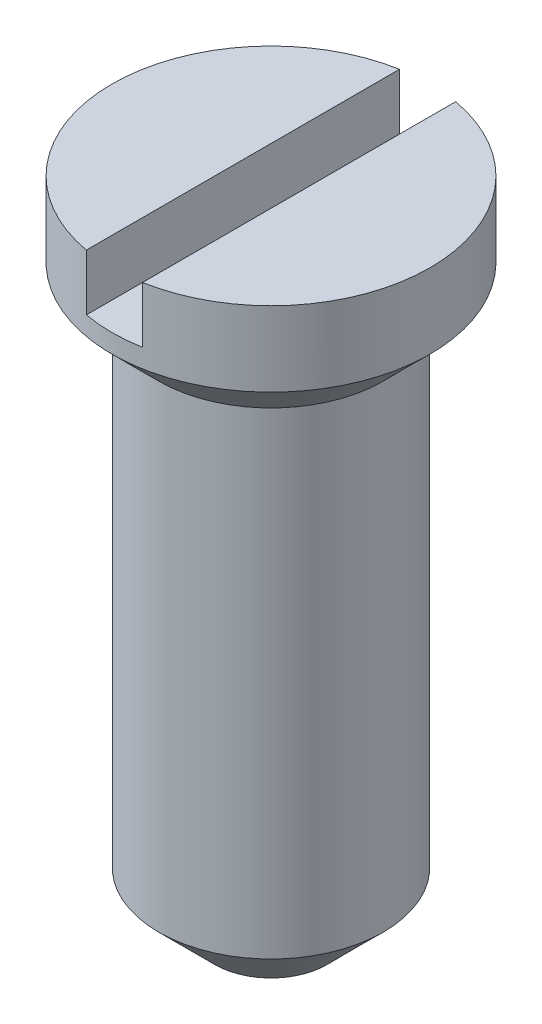
ISO-10303-21;
HEADER;
FILE_DESCRIPTION(('STEP AP214'),'2;1');
FILE_NAME('part.step','',(''),(''),'','','');
FILE_SCHEMA(('AUTOMOTIVE_DESIGN { 1 0 10303 214 1 1 1 1 }'));
ENDSEC;
DATA;
#1=APPLICATION_CONTEXT('core data for automotive mechanical design processes');
#2=APPLICATION_PROTOCOL_DEFINITION('international standard','automotive_design',2000,#1);
#3=PRODUCT_CONTEXT('',#1,'mechanical');
#4=PRODUCT('Part','Part','',(#3));
#5=PRODUCT_RELATED_PRODUCT_CATEGORY('part','',(#4));
#6=PRODUCT_DEFINITION_FORMATION('','',#4);
#7=PRODUCT_DEFINITION_CONTEXT('part definition',#1,'design');
#8=PRODUCT_DEFINITION('design','',#6,#7);
#9=PRODUCT_DEFINITION_SHAPE('','',#8);
#10=(LENGTH_UNIT() NAMED_UNIT(*) SI_UNIT(.MILLI.,.METRE.));
#11=(NAMED_UNIT(*) PLANE_ANGLE_UNIT() SI_UNIT($,.RADIAN.));
#12=(NAMED_UNIT(*) SI_UNIT($,.STERADIAN.) SOLID_ANGLE_UNIT());
#13=UNCERTAINTY_MEASURE_WITH_UNIT(LENGTH_MEASURE(1.E-05),#10,'distance_accuracy_value','');
#14=(GEOMETRIC_REPRESENTATION_CONTEXT(3) GLOBAL_UNCERTAINTY_ASSIGNED_CONTEXT((#13)) GLOBAL_UNIT_ASSIGNED_CONTEXT((#10,
#11,#12)) REPRESENTATION_CONTEXT('',''));
#15=CARTESIAN_POINT('',(0.,0.,0.));
#16=DIRECTION('',(0.,0.,1.));
#17=DIRECTION('',(1.,0.,0.));
#18=AXIS2_PLACEMENT_3D('',#15,#16,#17);
#19=CARTESIAN_POINT('',(0.,3.5,0.));
#20=DIRECTION('',(0.,1.,0.));
#21=DIRECTION('',(0.,0.,1.));
#22=AXIS2_PLACEMENT_3D('',#19,#20,#21);
#23=PLANE('',#22);
#24=DIRECTION('',(0.,0.,-1.));
#25=VECTOR('',#24,1.);
#26=CARTESIAN_POINT('',(0.15,3.5,0.));
#27=LINE('',#26,#25);
#28=CARTESIAN_POINT('',(0.15,3.5,0.836660026534075));
#29=VERTEX_POINT('',#28);
#30=CARTESIAN_POINT('',(0.15,3.5,-0.836660026534075));
#31=VERTEX_POINT('',#30);
#32=EDGE_CURVE('E81',#29,#31,#27,.T.);
#33=ORIENTED_EDGE('',*,*,#32,.F.);
#34=CARTESIAN_POINT('',(0.,3.5,0.));
#35=DIRECTION('',(0.,1.,0.));
#36=DIRECTION('',(0.,0.,1.));
#37=AXIS2_PLACEMENT_3D('',#34,#35,#36);
#38=CIRCLE('',#37,0.85);
#39=EDGE_CURVE('E93',#29,#31,#38,.T.);
#40=ORIENTED_EDGE('',*,*,#39,.T.);
#41=EDGE_LOOP('',(#33,#40));
#42=FACE_BOUND('',#41,.T.);
#43=ADVANCED_FACE('F33',(#42),#23,.T.);
#44=CARTESIAN_POINT('',(0.,3.5,0.));
#45=DIRECTION('',(0.,-1.,0.));
#46=DIRECTION('',(0.,0.,-1.));
#47=AXIS2_PLACEMENT_3D('',#44,#45,#46);
#48=CYLINDRICAL_SURFACE('',#47,0.85);
#49=ORIENTED_EDGE('',*,*,#39,.F.);
#50=DIRECTION('',(0.,-1.,0.));
#51=VECTOR('',#50,1.);
#52=CARTESIAN_POINT('',(0.15,3.5,0.836660026534075));
#53=LINE('',#52,#51);
#54=CARTESIAN_POINT('',(0.15,3.2,0.836660026534075));
#55=VERTEX_POINT('',#54);
#56=EDGE_CURVE('E116',#29,#55,#53,.T.);
#57=ORIENTED_EDGE('',*,*,#56,.T.);
#58=CARTESIAN_POINT('',(0.,3.2,0.));
#59=DIRECTION('',(0.,-1.,0.));
#60=DIRECTION('',(0.,0.,-1.));
#61=AXIS2_PLACEMENT_3D('',#58,#59,#60);
#62=CIRCLE('',#61,0.85);
#63=CARTESIAN_POINT('',(-0.15,3.2,0.836660026534075));
#64=VERTEX_POINT('',#63);
#65=EDGE_CURVE('E11',#55,#64,#62,.T.);
#66=ORIENTED_EDGE('',*,*,#65,.T.);
#67=DIRECTION('',(0.,-1.,0.));
#68=VECTOR('',#67,1.);
#69=CARTESIAN_POINT('',(-0.15,3.5,0.836660026534075));
#70=LINE('',#69,#68);
#71=CARTESIAN_POINT('',(-0.15,3.5,0.836660026534075));
#72=VERTEX_POINT('',#71);
#73=EDGE_CURVE('E76',#64,#72,#70,.F.);
#74=ORIENTED_EDGE('',*,*,#73,.T.);
#75=CARTESIAN_POINT('',(-0.15,3.5,-0.836660026534075));
#76=VERTEX_POINT('',#75);
#77=EDGE_CURVE('E88',#76,#72,#38,.T.);
#78=ORIENTED_EDGE('',*,*,#77,.F.);
#79=DIRECTION('',(0.,-1.,0.));
#80=VECTOR('',#79,1.);
#81=CARTESIAN_POINT('',(-0.15,3.5,-0.836660026534075));
#82=LINE('',#81,#80);
#83=CARTESIAN_POINT('',(-0.15,3.2,-0.836660026534075));
#84=VERTEX_POINT('',#83);
#85=EDGE_CURVE('E48',#76,#84,#82,.T.);
#86=ORIENTED_EDGE('',*,*,#85,.T.);
#87=CARTESIAN_POINT('',(0.15,3.2,-0.836660026534075));
#88=VERTEX_POINT('',#87);
#89=EDGE_CURVE('E37',#84,#88,#62,.T.);
#90=ORIENTED_EDGE('',*,*,#89,.T.);
#91=DIRECTION('',(0.,-1.,0.));
#92=VECTOR('',#91,1.);
#93=CARTESIAN_POINT('',(0.15,3.5,-0.836660026534075));
#94=LINE('',#93,#92);
#95=EDGE_CURVE('E56',#88,#31,#94,.F.);
#96=ORIENTED_EDGE('',*,*,#95,.T.);
#97=EDGE_LOOP('',(#49,#57,#66,#74,#78,#86,#90,#96));
#98=FACE_BOUND('',#97,.T.);
#99=CARTESIAN_POINT('',(0.,3.1,0.));
#100=DIRECTION('',(0.,-1.,0.));
#101=DIRECTION('',(0.,0.,-1.));
#102=AXIS2_PLACEMENT_3D('',#99,#100,#101);
#103=CIRCLE('',#102,0.85);
#104=CARTESIAN_POINT('',(0.,3.1,-0.85));
#105=VERTEX_POINT('',#104);
#106=EDGE_CURVE('E94',#105,#105,#103,.T.);
#107=ORIENTED_EDGE('',*,*,#106,.F.);
#108=EDGE_LOOP('',(#107));
#109=FACE_BOUND('',#108,.T.);
#110=ADVANCED_FACE('F86',(#98,#109),#48,.T.);
#111=DIRECTION('',(0.,0.,1.));
#112=VECTOR('',#111,1.);
#113=CARTESIAN_POINT('',(-0.15,3.5,0.));
#114=LINE('',#113,#112);
#115=EDGE_CURVE('E73',#76,#72,#114,.T.);
#116=ORIENTED_EDGE('',*,*,#115,.F.);
#117=ORIENTED_EDGE('',*,*,#77,.T.);
#118=EDGE_LOOP('',(#116,#117));
#119=FACE_BOUND('',#118,.T.);
#120=ADVANCED_FACE('F92',(#119),#23,.T.);
#121=CARTESIAN_POINT('',(0.,0.,0.));
#122=DIRECTION('',(0.,-1.,0.));
#123=DIRECTION('',(0.,0.,-1.));
#124=AXIS2_PLACEMENT_3D('',#121,#122,#123);
#125=CYLINDRICAL_SURFACE('',#124,0.6);
#126=CARTESIAN_POINT('',(0.,0.300000000000001,0.));
#127=DIRECTION('',(0.,1.,0.));
#128=DIRECTION('',(0.,0.,1.));
#129=AXIS2_PLACEMENT_3D('',#126,#127,#128);
#130=CIRCLE('',#129,0.6);
#131=CARTESIAN_POINT('',(0.,0.300000000000001,0.6));
#132=VERTEX_POINT('',#131);
#133=EDGE_CURVE('E82',#132,#132,#130,.T.);
#134=ORIENTED_EDGE('',*,*,#133,.T.);
#135=EDGE_LOOP('',(#134));
#136=FACE_BOUND('',#135,.T.);
#137=CARTESIAN_POINT('',(0.,2.85,0.));
#138=DIRECTION('',(0.,-1.,0.));
#139=DIRECTION('',(0.,0.,-1.));
#140=AXIS2_PLACEMENT_3D('',#137,#138,#139);
#141=CIRCLE('',#140,0.6);
#142=CARTESIAN_POINT('',(0.,2.85,-0.6));
#143=VERTEX_POINT('',#142);
#144=EDGE_CURVE('E99',#143,#143,#141,.T.);
#145=ORIENTED_EDGE('',*,*,#144,.T.);
#146=EDGE_LOOP('',(#145));
#147=FACE_BOUND('',#146,.T.);
#148=ADVANCED_FACE('F120',(#136,#147),#125,.T.);
#149=CARTESIAN_POINT('',(0.,3.1,0.));
#150=DIRECTION('',(0.,1.,0.));
#151=DIRECTION('',(0.,0.,1.));
#152=AXIS2_PLACEMENT_3D('',#149,#150,#151);
#153=CONICAL_SURFACE('',#152,0.85,0.785398163397448);
#154=ORIENTED_EDGE('',*,*,#144,.F.);
#155=EDGE_LOOP('',(#154));
#156=FACE_BOUND('',#155,.T.);
#157=ORIENTED_EDGE('',*,*,#106,.T.);
#158=EDGE_LOOP('',(#157));
#159=FACE_BOUND('',#158,.T.);
#160=ADVANCED_FACE('F122',(#156,#159),#153,.T.);
#161=CARTESIAN_POINT('',(0.,0.,0.));
#162=DIRECTION('',(0.,1.,0.));
#163=DIRECTION('',(0.,0.,1.));
#164=AXIS2_PLACEMENT_3D('',#161,#162,#163);
#165=PLANE('',#164);
#166=CARTESIAN_POINT('',(0.,0.,0.));
#167=DIRECTION('',(0.,1.,0.));
#168=DIRECTION('',(0.,0.,1.));
#169=AXIS2_PLACEMENT_3D('',#166,#167,#168);
#170=CIRCLE('',#169,0.3);
#171=CARTESIAN_POINT('',(0.,0.,0.3));
#172=VERTEX_POINT('',#171);
#173=EDGE_CURVE('E97',#172,#172,#170,.F.);
#174=ORIENTED_EDGE('',*,*,#173,.T.);
#175=EDGE_LOOP('',(#174));
#176=FACE_BOUND('',#175,.T.);
#177=ADVANCED_FACE('F125',(#176),#165,.F.);
#178=CARTESIAN_POINT('',(0.,0.,0.));
#179=DIRECTION('',(0.,1.,0.));
#180=DIRECTION('',(0.,0.,1.));
#181=AXIS2_PLACEMENT_3D('',#178,#179,#180);
#182=CONICAL_SURFACE('',#181,0.3,0.785398163397447);
#183=ORIENTED_EDGE('',*,*,#133,.F.);
#184=EDGE_LOOP('',(#183));
#185=FACE_BOUND('',#184,.T.);
#186=ORIENTED_EDGE('',*,*,#173,.F.);
#187=EDGE_LOOP('',(#186));
#188=FACE_BOUND('',#187,.T.);
#189=ADVANCED_FACE('F35',(#185,#188),#182,.T.);
#190=CARTESIAN_POINT('',(0.,3.2,0.));
#191=DIRECTION('',(0.,-1.,0.));
#192=DIRECTION('',(0.,0.,-1.));
#193=AXIS2_PLACEMENT_3D('',#190,#191,#192);
#194=PLANE('',#193);
#195=DIRECTION('',(0.,0.,-1.));
#196=VECTOR('',#195,1.);
#197=CARTESIAN_POINT('',(0.15,3.2,0.95));
#198=LINE('',#197,#196);
#199=EDGE_CURVE('E110',#55,#88,#198,.T.);
#200=ORIENTED_EDGE('',*,*,#199,.T.);
#201=ORIENTED_EDGE('',*,*,#89,.F.);
#202=DIRECTION('',(0.,0.,1.));
#203=VECTOR('',#202,1.);
#204=CARTESIAN_POINT('',(-0.15,3.2,0.95));
#205=LINE('',#204,#203);
#206=EDGE_CURVE('E90',#84,#64,#205,.T.);
#207=ORIENTED_EDGE('',*,*,#206,.T.);
#208=ORIENTED_EDGE('',*,*,#65,.F.);
#209=EDGE_LOOP('',(#200,#201,#207,#208));
#210=FACE_BOUND('',#209,.T.);
#211=ADVANCED_FACE('F109',(#210),#194,.F.);
#212=CARTESIAN_POINT('',(0.15,3.2,0.95));
#213=DIRECTION('',(1.,0.,0.));
#214=DIRECTION('',(0.,0.,-1.));
#215=AXIS2_PLACEMENT_3D('',#212,#213,#214);
#216=PLANE('',#215);
#217=ORIENTED_EDGE('',*,*,#32,.T.);
#218=ORIENTED_EDGE('',*,*,#95,.F.);
#219=ORIENTED_EDGE('',*,*,#199,.F.);
#220=ORIENTED_EDGE('',*,*,#56,.F.);
#221=EDGE_LOOP('',(#217,#218,#219,#220));
#222=FACE_BOUND('',#221,.T.);
#223=ADVANCED_FACE('F142',(#222),#216,.F.);
#224=CARTESIAN_POINT('',(-0.15,3.2,0.95));
#225=DIRECTION('',(-1.,0.,0.));
#226=DIRECTION('',(0.,0.,1.));
#227=AXIS2_PLACEMENT_3D('',#224,#225,#226);
#228=PLANE('',#227);
#229=ORIENTED_EDGE('',*,*,#115,.T.);
#230=ORIENTED_EDGE('',*,*,#73,.F.);
#231=ORIENTED_EDGE('',*,*,#206,.F.);
#232=ORIENTED_EDGE('',*,*,#85,.F.);
#233=EDGE_LOOP('',(#229,#230,#231,#232));
#234=FACE_BOUND('',#233,.T.);
#235=ADVANCED_FACE('F75',(#234),#228,.F.);
#236=CLOSED_SHELL('',(#43,#110,#120,#148,#160,#177,#189,#211,#223,#235));
#237=MANIFOLD_SOLID_BREP('B2',#236);
#238=ADVANCED_BREP_SHAPE_REPRESENTATION('',(#18,#237),#14);
#239=SHAPE_DEFINITION_REPRESENTATION(#9,#238);
ENDSEC;
END-ISO-10303-21;
